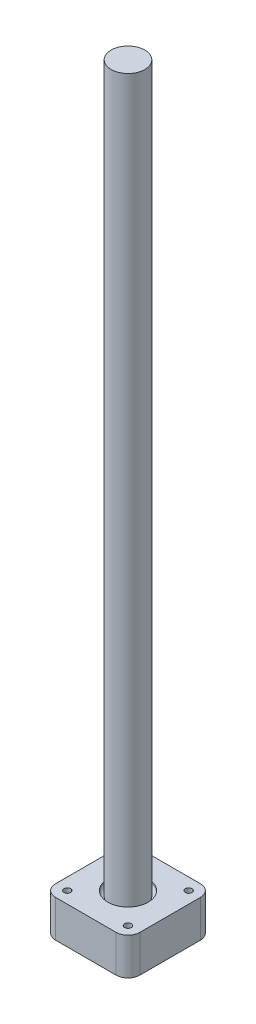
ISO-10303-21;
HEADER;
FILE_DESCRIPTION(('STEP AP214'),'2;1');
FILE_NAME('part.step','',(''),(''),'','','');
FILE_SCHEMA(('AUTOMOTIVE_DESIGN { 1 0 10303 214 1 1 1 1 }'));
ENDSEC;
DATA;
#1=APPLICATION_CONTEXT('core data for automotive mechanical design processes');
#2=APPLICATION_PROTOCOL_DEFINITION('international standard','automotive_design',2000,#1);
#3=PRODUCT_CONTEXT('',#1,'mechanical');
#4=PRODUCT('Part','Part','',(#3));
#5=PRODUCT_RELATED_PRODUCT_CATEGORY('part','',(#4));
#6=PRODUCT_DEFINITION_FORMATION('','',#4);
#7=PRODUCT_DEFINITION_CONTEXT('part definition',#1,'design');
#8=PRODUCT_DEFINITION('design','',#6,#7);
#9=PRODUCT_DEFINITION_SHAPE('','',#8);
#10=(LENGTH_UNIT() NAMED_UNIT(*) SI_UNIT(.MILLI.,.METRE.));
#11=(NAMED_UNIT(*) PLANE_ANGLE_UNIT() SI_UNIT($,.RADIAN.));
#12=(NAMED_UNIT(*) SI_UNIT($,.STERADIAN.) SOLID_ANGLE_UNIT());
#13=UNCERTAINTY_MEASURE_WITH_UNIT(LENGTH_MEASURE(1.E-05),#10,'distance_accuracy_value','');
#14=(GEOMETRIC_REPRESENTATION_CONTEXT(3) GLOBAL_UNCERTAINTY_ASSIGNED_CONTEXT((#13)) GLOBAL_UNIT_ASSIGNED_CONTEXT((#10,
#11,#12)) REPRESENTATION_CONTEXT('',''));
#15=CARTESIAN_POINT('',(0.,0.,0.));
#16=DIRECTION('',(0.,0.,1.));
#17=DIRECTION('',(1.,0.,0.));
#18=AXIS2_PLACEMENT_3D('',#15,#16,#17);
#19=CARTESIAN_POINT('',(50.,22.,0.));
#20=DIRECTION('',(0.,0.,1.));
#21=DIRECTION('',(1.,0.,0.));
#22=AXIS2_PLACEMENT_3D('',#19,#20,#21);
#23=PLANE('',#22);
#24=DIRECTION('',(-1.,0.,0.));
#25=VECTOR('',#24,1.);
#26=CARTESIAN_POINT('',(50.,0.,0.));
#27=LINE('',#26,#25);
#28=CARTESIAN_POINT('',(43.,0.,0.));
#29=VERTEX_POINT('',#28);
#30=CARTESIAN_POINT('',(7.,0.,0.));
#31=VERTEX_POINT('',#30);
#32=EDGE_CURVE('E128',#29,#31,#27,.T.);
#33=ORIENTED_EDGE('',*,*,#32,.T.);
#34=DIRECTION('',(0.,-1.,0.));
#35=VECTOR('',#34,1.);
#36=CARTESIAN_POINT('',(7.,22.,0.));
#37=LINE('',#36,#35);
#38=CARTESIAN_POINT('',(7.,22.,0.));
#39=VERTEX_POINT('',#38);
#40=EDGE_CURVE('E106',#31,#39,#37,.F.);
#41=ORIENTED_EDGE('',*,*,#40,.T.);
#42=DIRECTION('',(-1.,0.,0.));
#43=VECTOR('',#42,1.);
#44=CARTESIAN_POINT('',(50.,22.,0.));
#45=LINE('',#44,#43);
#46=CARTESIAN_POINT('',(43.,22.,0.));
#47=VERTEX_POINT('',#46);
#48=EDGE_CURVE('E138',#47,#39,#45,.T.);
#49=ORIENTED_EDGE('',*,*,#48,.F.);
#50=DIRECTION('',(0.,-1.,0.));
#51=VECTOR('',#50,1.);
#52=CARTESIAN_POINT('',(43.,22.,0.));
#53=LINE('',#52,#51);
#54=EDGE_CURVE('E111',#47,#29,#53,.T.);
#55=ORIENTED_EDGE('',*,*,#54,.T.);
#56=EDGE_LOOP('',(#33,#41,#49,#55));
#57=FACE_BOUND('',#56,.T.);
#58=ADVANCED_FACE('F34',(#57),#23,.F.);
#59=CARTESIAN_POINT('',(0.,22.,0.));
#60=DIRECTION('',(1.,0.,0.));
#61=DIRECTION('',(0.,0.,-1.));
#62=AXIS2_PLACEMENT_3D('',#59,#60,#61);
#63=PLANE('',#62);
#64=DIRECTION('',(0.,0.,1.));
#65=VECTOR('',#64,1.);
#66=CARTESIAN_POINT('',(0.,22.,0.));
#67=LINE('',#66,#65);
#68=CARTESIAN_POINT('',(0.,22.,7.));
#69=VERTEX_POINT('',#68);
#70=CARTESIAN_POINT('',(0.,22.,43.));
#71=VERTEX_POINT('',#70);
#72=EDGE_CURVE('E121',#69,#71,#67,.T.);
#73=ORIENTED_EDGE('',*,*,#72,.F.);
#74=DIRECTION('',(0.,-1.,0.));
#75=VECTOR('',#74,1.);
#76=CARTESIAN_POINT('',(0.,22.,7.));
#77=LINE('',#76,#75);
#78=CARTESIAN_POINT('',(0.,0.,7.));
#79=VERTEX_POINT('',#78);
#80=EDGE_CURVE('E105',#69,#79,#77,.T.);
#81=ORIENTED_EDGE('',*,*,#80,.T.);
#82=DIRECTION('',(0.,0.,1.));
#83=VECTOR('',#82,1.);
#84=CARTESIAN_POINT('',(0.,0.,0.));
#85=LINE('',#84,#83);
#86=CARTESIAN_POINT('',(0.,0.,43.));
#87=VERTEX_POINT('',#86);
#88=EDGE_CURVE('E118',#79,#87,#85,.T.);
#89=ORIENTED_EDGE('',*,*,#88,.T.);
#90=DIRECTION('',(0.,-1.,0.));
#91=VECTOR('',#90,1.);
#92=CARTESIAN_POINT('',(0.,22.,43.));
#93=LINE('',#92,#91);
#94=EDGE_CURVE('E123',#87,#71,#93,.F.);
#95=ORIENTED_EDGE('',*,*,#94,.T.);
#96=EDGE_LOOP('',(#73,#81,#89,#95));
#97=FACE_BOUND('',#96,.T.);
#98=ADVANCED_FACE('F117',(#97),#63,.F.);
#99=CARTESIAN_POINT('',(0.,22.,50.));
#100=DIRECTION('',(0.,0.,-1.));
#101=DIRECTION('',(-1.,0.,0.));
#102=AXIS2_PLACEMENT_3D('',#99,#100,#101);
#103=PLANE('',#102);
#104=DIRECTION('',(1.,0.,0.));
#105=VECTOR('',#104,1.);
#106=CARTESIAN_POINT('',(0.,0.,50.));
#107=LINE('',#106,#105);
#108=CARTESIAN_POINT('',(7.00000000000001,0.,50.));
#109=VERTEX_POINT('',#108);
#110=CARTESIAN_POINT('',(43.,0.,50.));
#111=VERTEX_POINT('',#110);
#112=EDGE_CURVE('E127',#109,#111,#107,.T.);
#113=ORIENTED_EDGE('',*,*,#112,.T.);
#114=DIRECTION('',(0.,-1.,0.));
#115=VECTOR('',#114,1.);
#116=CARTESIAN_POINT('',(43.,22.,50.));
#117=LINE('',#116,#115);
#118=CARTESIAN_POINT('',(43.,22.,50.));
#119=VERTEX_POINT('',#118);
#120=EDGE_CURVE('E162',#111,#119,#117,.F.);
#121=ORIENTED_EDGE('',*,*,#120,.T.);
#122=DIRECTION('',(1.,0.,0.));
#123=VECTOR('',#122,1.);
#124=CARTESIAN_POINT('',(0.,22.,50.));
#125=LINE('',#124,#123);
#126=CARTESIAN_POINT('',(7.00000000000001,22.,50.));
#127=VERTEX_POINT('',#126);
#128=EDGE_CURVE('E216',#127,#119,#125,.T.);
#129=ORIENTED_EDGE('',*,*,#128,.F.);
#130=DIRECTION('',(0.,-1.,0.));
#131=VECTOR('',#130,1.);
#132=CARTESIAN_POINT('',(7.00000000000001,22.,50.));
#133=LINE('',#132,#131);
#134=EDGE_CURVE('E159',#127,#109,#133,.T.);
#135=ORIENTED_EDGE('',*,*,#134,.T.);
#136=EDGE_LOOP('',(#113,#121,#129,#135));
#137=FACE_BOUND('',#136,.T.);
#138=ADVANCED_FACE('F188',(#137),#103,.F.);
#139=CARTESIAN_POINT('',(50.,22.,50.));
#140=DIRECTION('',(-1.,0.,0.));
#141=DIRECTION('',(0.,0.,1.));
#142=AXIS2_PLACEMENT_3D('',#139,#140,#141);
#143=PLANE('',#142);
#144=DIRECTION('',(0.,0.,-1.));
#145=VECTOR('',#144,1.);
#146=CARTESIAN_POINT('',(50.,0.,50.));
#147=LINE('',#146,#145);
#148=CARTESIAN_POINT('',(50.,0.,43.));
#149=VERTEX_POINT('',#148);
#150=CARTESIAN_POINT('',(50.,0.,7.));
#151=VERTEX_POINT('',#150);
#152=EDGE_CURVE('E131',#149,#151,#147,.T.);
#153=ORIENTED_EDGE('',*,*,#152,.T.);
#154=DIRECTION('',(0.,-1.,0.));
#155=VECTOR('',#154,1.);
#156=CARTESIAN_POINT('',(50.,22.,7.));
#157=LINE('',#156,#155);
#158=CARTESIAN_POINT('',(50.,22.,7.));
#159=VERTEX_POINT('',#158);
#160=EDGE_CURVE('E49',#151,#159,#157,.F.);
#161=ORIENTED_EDGE('',*,*,#160,.T.);
#162=DIRECTION('',(0.,0.,-1.));
#163=VECTOR('',#162,1.);
#164=CARTESIAN_POINT('',(50.,22.,50.));
#165=LINE('',#164,#163);
#166=CARTESIAN_POINT('',(50.,22.,43.));
#167=VERTEX_POINT('',#166);
#168=EDGE_CURVE('E139',#167,#159,#165,.T.);
#169=ORIENTED_EDGE('',*,*,#168,.F.);
#170=DIRECTION('',(0.,-1.,0.));
#171=VECTOR('',#170,1.);
#172=CARTESIAN_POINT('',(50.,22.,43.));
#173=LINE('',#172,#171);
#174=EDGE_CURVE('E155',#167,#149,#173,.T.);
#175=ORIENTED_EDGE('',*,*,#174,.T.);
#176=EDGE_LOOP('',(#153,#161,#169,#175));
#177=FACE_BOUND('',#176,.T.);
#178=ADVANCED_FACE('F270',(#177),#143,.F.);
#179=CARTESIAN_POINT('',(0.,22.,0.));
#180=DIRECTION('',(0.,1.,0.));
#181=DIRECTION('',(0.,0.,1.));
#182=AXIS2_PLACEMENT_3D('',#179,#180,#181);
#183=PLANE('',#182);
#184=CARTESIAN_POINT('',(25.,22.,25.));
#185=DIRECTION('',(0.,1.,0.));
#186=DIRECTION('',(0.,0.,1.));
#187=AXIS2_PLACEMENT_3D('',#184,#185,#186);
#188=CIRCLE('',#187,12.);
#189=CARTESIAN_POINT('',(25.,22.,37.));
#190=VERTEX_POINT('',#189);
#191=EDGE_CURVE('E233',#190,#190,#188,.T.);
#192=ORIENTED_EDGE('',*,*,#191,.F.);
#193=EDGE_LOOP('',(#192));
#194=FACE_BOUND('',#193,.T.);
#195=CARTESIAN_POINT('',(43.,22.,7.));
#196=DIRECTION('',(0.,1.,0.));
#197=DIRECTION('',(0.,0.,1.));
#198=AXIS2_PLACEMENT_3D('',#195,#196,#197);
#199=CIRCLE('',#198,2.);
#200=CARTESIAN_POINT('',(43.,22.,9.));
#201=VERTEX_POINT('',#200);
#202=EDGE_CURVE('E229',#201,#201,#199,.T.);
#203=ORIENTED_EDGE('',*,*,#202,.F.);
#204=EDGE_LOOP('',(#203));
#205=FACE_BOUND('',#204,.T.);
#206=CARTESIAN_POINT('',(43.,22.,43.));
#207=DIRECTION('',(0.,1.,0.));
#208=DIRECTION('',(0.,0.,1.));
#209=AXIS2_PLACEMENT_3D('',#206,#207,#208);
#210=CIRCLE('',#209,2.);
#211=CARTESIAN_POINT('',(43.,22.,45.));
#212=VERTEX_POINT('',#211);
#213=EDGE_CURVE('E236',#212,#212,#210,.T.);
#214=ORIENTED_EDGE('',*,*,#213,.F.);
#215=EDGE_LOOP('',(#214));
#216=FACE_BOUND('',#215,.T.);
#217=CARTESIAN_POINT('',(7.00000000000001,22.,43.));
#218=DIRECTION('',(0.,1.,0.));
#219=DIRECTION('',(0.,0.,1.));
#220=AXIS2_PLACEMENT_3D('',#217,#218,#219);
#221=CIRCLE('',#220,2.);
#222=CARTESIAN_POINT('',(7.00000000000001,22.,45.));
#223=VERTEX_POINT('',#222);
#224=EDGE_CURVE('E242',#223,#223,#221,.T.);
#225=ORIENTED_EDGE('',*,*,#224,.F.);
#226=EDGE_LOOP('',(#225));
#227=FACE_BOUND('',#226,.T.);
#228=CARTESIAN_POINT('',(7.,22.,7.));
#229=DIRECTION('',(0.,1.,0.));
#230=DIRECTION('',(0.,0.,1.));
#231=AXIS2_PLACEMENT_3D('',#228,#229,#230);
#232=CIRCLE('',#231,2.);
#233=CARTESIAN_POINT('',(7.,22.,9.));
#234=VERTEX_POINT('',#233);
#235=EDGE_CURVE('E223',#234,#234,#232,.T.);
#236=ORIENTED_EDGE('',*,*,#235,.F.);
#237=EDGE_LOOP('',(#236));
#238=FACE_BOUND('',#237,.T.);
#239=ORIENTED_EDGE('',*,*,#48,.T.);
#240=CARTESIAN_POINT('',(7.,22.,7.));
#241=DIRECTION('',(0.,1.,0.));
#242=DIRECTION('',(0.,0.,1.));
#243=AXIS2_PLACEMENT_3D('',#240,#241,#242);
#244=CIRCLE('',#243,7.);
#245=EDGE_CURVE('E153',#39,#69,#244,.T.);
#246=ORIENTED_EDGE('',*,*,#245,.T.);
#247=ORIENTED_EDGE('',*,*,#72,.T.);
#248=CARTESIAN_POINT('',(7.00000000000001,22.,43.));
#249=DIRECTION('',(0.,1.,0.));
#250=DIRECTION('',(0.,0.,1.));
#251=AXIS2_PLACEMENT_3D('',#248,#249,#250);
#252=CIRCLE('',#251,7.);
#253=EDGE_CURVE('E148',#71,#127,#252,.T.);
#254=ORIENTED_EDGE('',*,*,#253,.T.);
#255=ORIENTED_EDGE('',*,*,#128,.T.);
#256=CARTESIAN_POINT('',(43.,22.,43.));
#257=DIRECTION('',(0.,1.,0.));
#258=DIRECTION('',(0.,0.,1.));
#259=AXIS2_PLACEMENT_3D('',#256,#257,#258);
#260=CIRCLE('',#259,7.);
#261=EDGE_CURVE('E56',#119,#167,#260,.T.);
#262=ORIENTED_EDGE('',*,*,#261,.T.);
#263=ORIENTED_EDGE('',*,*,#168,.T.);
#264=CARTESIAN_POINT('',(43.,22.,7.));
#265=DIRECTION('',(0.,1.,0.));
#266=DIRECTION('',(0.,0.,1.));
#267=AXIS2_PLACEMENT_3D('',#264,#265,#266);
#268=CIRCLE('',#267,7.);
#269=EDGE_CURVE('E151',#159,#47,#268,.T.);
#270=ORIENTED_EDGE('',*,*,#269,.T.);
#271=EDGE_LOOP('',(#239,#246,#247,#254,#255,#262,#263,#270));
#272=FACE_BOUND('',#271,.T.);
#273=ADVANCED_FACE('F215',(#194,#205,#216,#227,#238,#272),#183,.T.);
#274=CARTESIAN_POINT('',(0.,0.,0.));
#275=DIRECTION('',(0.,1.,0.));
#276=DIRECTION('',(0.,0.,1.));
#277=AXIS2_PLACEMENT_3D('',#274,#275,#276);
#278=PLANE('',#277);
#279=CARTESIAN_POINT('',(43.,0.,7.));
#280=DIRECTION('',(0.,1.,0.));
#281=DIRECTION('',(0.,0.,1.));
#282=AXIS2_PLACEMENT_3D('',#279,#280,#281);
#283=CIRCLE('',#282,2.);
#284=CARTESIAN_POINT('',(43.,0.,9.));
#285=VERTEX_POINT('',#284);
#286=EDGE_CURVE('E232',#285,#285,#283,.T.);
#287=ORIENTED_EDGE('',*,*,#286,.T.);
#288=EDGE_LOOP('',(#287));
#289=FACE_BOUND('',#288,.T.);
#290=CARTESIAN_POINT('',(43.,0.,43.));
#291=DIRECTION('',(0.,1.,0.));
#292=DIRECTION('',(0.,0.,1.));
#293=AXIS2_PLACEMENT_3D('',#290,#291,#292);
#294=CIRCLE('',#293,2.);
#295=CARTESIAN_POINT('',(43.,0.,45.));
#296=VERTEX_POINT('',#295);
#297=EDGE_CURVE('E239',#296,#296,#294,.T.);
#298=ORIENTED_EDGE('',*,*,#297,.T.);
#299=EDGE_LOOP('',(#298));
#300=FACE_BOUND('',#299,.T.);
#301=CARTESIAN_POINT('',(7.00000000000001,0.,43.));
#302=DIRECTION('',(0.,1.,0.));
#303=DIRECTION('',(0.,0.,1.));
#304=AXIS2_PLACEMENT_3D('',#301,#302,#303);
#305=CIRCLE('',#304,2.);
#306=CARTESIAN_POINT('',(7.00000000000001,0.,45.));
#307=VERTEX_POINT('',#306);
#308=EDGE_CURVE('E226',#307,#307,#305,.T.);
#309=ORIENTED_EDGE('',*,*,#308,.T.);
#310=EDGE_LOOP('',(#309));
#311=FACE_BOUND('',#310,.T.);
#312=CARTESIAN_POINT('',(7.,0.,7.));
#313=DIRECTION('',(0.,1.,0.));
#314=DIRECTION('',(0.,0.,1.));
#315=AXIS2_PLACEMENT_3D('',#312,#313,#314);
#316=CIRCLE('',#315,2.);
#317=CARTESIAN_POINT('',(7.,0.,9.));
#318=VERTEX_POINT('',#317);
#319=EDGE_CURVE('E133',#318,#318,#316,.T.);
#320=ORIENTED_EDGE('',*,*,#319,.T.);
#321=EDGE_LOOP('',(#320));
#322=FACE_BOUND('',#321,.T.);
#323=ORIENTED_EDGE('',*,*,#88,.F.);
#324=CARTESIAN_POINT('',(7.,0.,7.));
#325=DIRECTION('',(0.,1.,0.));
#326=DIRECTION('',(0.,0.,1.));
#327=AXIS2_PLACEMENT_3D('',#324,#325,#326);
#328=CIRCLE('',#327,7.);
#329=EDGE_CURVE('E101',#79,#31,#328,.F.);
#330=ORIENTED_EDGE('',*,*,#329,.T.);
#331=ORIENTED_EDGE('',*,*,#32,.F.);
#332=CARTESIAN_POINT('',(43.,0.,7.));
#333=DIRECTION('',(0.,1.,0.));
#334=DIRECTION('',(0.,0.,1.));
#335=AXIS2_PLACEMENT_3D('',#332,#333,#334);
#336=CIRCLE('',#335,7.);
#337=EDGE_CURVE('E112',#29,#151,#336,.F.);
#338=ORIENTED_EDGE('',*,*,#337,.T.);
#339=ORIENTED_EDGE('',*,*,#152,.F.);
#340=CARTESIAN_POINT('',(43.,0.,43.));
#341=DIRECTION('',(0.,1.,0.));
#342=DIRECTION('',(0.,0.,1.));
#343=AXIS2_PLACEMENT_3D('',#340,#341,#342);
#344=CIRCLE('',#343,7.);
#345=EDGE_CURVE('E142',#149,#111,#344,.F.);
#346=ORIENTED_EDGE('',*,*,#345,.T.);
#347=ORIENTED_EDGE('',*,*,#112,.F.);
#348=CARTESIAN_POINT('',(7.00000000000001,0.,43.));
#349=DIRECTION('',(0.,1.,0.));
#350=DIRECTION('',(0.,0.,1.));
#351=AXIS2_PLACEMENT_3D('',#348,#349,#350);
#352=CIRCLE('',#351,7.);
#353=EDGE_CURVE('E122',#109,#87,#352,.F.);
#354=ORIENTED_EDGE('',*,*,#353,.T.);
#355=EDGE_LOOP('',(#323,#330,#331,#338,#339,#346,#347,#354));
#356=FACE_BOUND('',#355,.T.);
#357=ADVANCED_FACE('F125',(#289,#300,#311,#322,#356),#278,.F.);
#358=CARTESIAN_POINT('',(7.,22.,7.));
#359=DIRECTION('',(0.,-1.,0.));
#360=DIRECTION('',(0.,0.,-1.));
#361=AXIS2_PLACEMENT_3D('',#358,#359,#360);
#362=CYLINDRICAL_SURFACE('',#361,7.);
#363=ORIENTED_EDGE('',*,*,#245,.F.);
#364=ORIENTED_EDGE('',*,*,#40,.F.);
#365=ORIENTED_EDGE('',*,*,#329,.F.);
#366=ORIENTED_EDGE('',*,*,#80,.F.);
#367=EDGE_LOOP('',(#363,#364,#365,#366));
#368=FACE_BOUND('',#367,.T.);
#369=ADVANCED_FACE('F104',(#368),#362,.T.);
#370=CARTESIAN_POINT('',(43.,22.,7.));
#371=DIRECTION('',(0.,-1.,0.));
#372=DIRECTION('',(0.,0.,-1.));
#373=AXIS2_PLACEMENT_3D('',#370,#371,#372);
#374=CYLINDRICAL_SURFACE('',#373,7.);
#375=ORIENTED_EDGE('',*,*,#269,.F.);
#376=ORIENTED_EDGE('',*,*,#160,.F.);
#377=ORIENTED_EDGE('',*,*,#337,.F.);
#378=ORIENTED_EDGE('',*,*,#54,.F.);
#379=EDGE_LOOP('',(#375,#376,#377,#378));
#380=FACE_BOUND('',#379,.T.);
#381=ADVANCED_FACE('F194',(#380),#374,.T.);
#382=CARTESIAN_POINT('',(43.,22.,43.));
#383=DIRECTION('',(0.,-1.,0.));
#384=DIRECTION('',(0.,0.,-1.));
#385=AXIS2_PLACEMENT_3D('',#382,#383,#384);
#386=CYLINDRICAL_SURFACE('',#385,7.);
#387=ORIENTED_EDGE('',*,*,#261,.F.);
#388=ORIENTED_EDGE('',*,*,#120,.F.);
#389=ORIENTED_EDGE('',*,*,#345,.F.);
#390=ORIENTED_EDGE('',*,*,#174,.F.);
#391=EDGE_LOOP('',(#387,#388,#389,#390));
#392=FACE_BOUND('',#391,.T.);
#393=ADVANCED_FACE('F197',(#392),#386,.T.);
#394=CARTESIAN_POINT('',(7.00000000000001,22.,43.));
#395=DIRECTION('',(0.,-1.,0.));
#396=DIRECTION('',(0.,0.,-1.));
#397=AXIS2_PLACEMENT_3D('',#394,#395,#396);
#398=CYLINDRICAL_SURFACE('',#397,7.);
#399=ORIENTED_EDGE('',*,*,#253,.F.);
#400=ORIENTED_EDGE('',*,*,#94,.F.);
#401=ORIENTED_EDGE('',*,*,#353,.F.);
#402=ORIENTED_EDGE('',*,*,#134,.F.);
#403=EDGE_LOOP('',(#399,#400,#401,#402));
#404=FACE_BOUND('',#403,.T.);
#405=ADVANCED_FACE('F200',(#404),#398,.T.);
#406=CARTESIAN_POINT('',(7.,0.,7.));
#407=DIRECTION('',(0.,1.,0.));
#408=DIRECTION('',(0.,0.,1.));
#409=AXIS2_PLACEMENT_3D('',#406,#407,#408);
#410=CYLINDRICAL_SURFACE('',#409,2.);
#411=ORIENTED_EDGE('',*,*,#319,.F.);
#412=EDGE_LOOP('',(#411));
#413=FACE_BOUND('',#412,.T.);
#414=ORIENTED_EDGE('',*,*,#235,.T.);
#415=EDGE_LOOP('',(#414));
#416=FACE_BOUND('',#415,.T.);
#417=ADVANCED_FACE('F203',(#413,#416),#410,.F.);
#418=CARTESIAN_POINT('',(7.00000000000001,0.,43.));
#419=DIRECTION('',(0.,1.,0.));
#420=DIRECTION('',(0.,0.,1.));
#421=AXIS2_PLACEMENT_3D('',#418,#419,#420);
#422=CYLINDRICAL_SURFACE('',#421,2.);
#423=ORIENTED_EDGE('',*,*,#308,.F.);
#424=EDGE_LOOP('',(#423));
#425=FACE_BOUND('',#424,.T.);
#426=ORIENTED_EDGE('',*,*,#224,.T.);
#427=EDGE_LOOP('',(#426));
#428=FACE_BOUND('',#427,.T.);
#429=ADVANCED_FACE('F208',(#425,#428),#422,.F.);
#430=CARTESIAN_POINT('',(43.,0.,43.));
#431=DIRECTION('',(0.,1.,0.));
#432=DIRECTION('',(0.,0.,1.));
#433=AXIS2_PLACEMENT_3D('',#430,#431,#432);
#434=CYLINDRICAL_SURFACE('',#433,2.);
#435=ORIENTED_EDGE('',*,*,#297,.F.);
#436=EDGE_LOOP('',(#435));
#437=FACE_BOUND('',#436,.T.);
#438=ORIENTED_EDGE('',*,*,#213,.T.);
#439=EDGE_LOOP('',(#438));
#440=FACE_BOUND('',#439,.T.);
#441=ADVANCED_FACE('F260',(#437,#440),#434,.F.);
#442=CARTESIAN_POINT('',(43.,0.,7.));
#443=DIRECTION('',(0.,1.,0.));
#444=DIRECTION('',(0.,0.,1.));
#445=AXIS2_PLACEMENT_3D('',#442,#443,#444);
#446=CYLINDRICAL_SURFACE('',#445,2.);
#447=ORIENTED_EDGE('',*,*,#286,.F.);
#448=EDGE_LOOP('',(#447));
#449=FACE_BOUND('',#448,.T.);
#450=ORIENTED_EDGE('',*,*,#202,.T.);
#451=EDGE_LOOP('',(#450));
#452=FACE_BOUND('',#451,.T.);
#453=ADVANCED_FACE('F178',(#449,#452),#446,.F.);
#454=CARTESIAN_POINT('',(25.,19.,25.));
#455=DIRECTION('',(0.,1.,0.));
#456=DIRECTION('',(0.,0.,1.));
#457=AXIS2_PLACEMENT_3D('',#454,#455,#456);
#458=CYLINDRICAL_SURFACE('',#457,12.);
#459=CARTESIAN_POINT('',(25.,21.,25.));
#460=DIRECTION('',(0.,1.,0.));
#461=DIRECTION('',(0.,0.,1.));
#462=AXIS2_PLACEMENT_3D('',#459,#460,#461);
#463=CIRCLE('',#462,12.);
#464=CARTESIAN_POINT('',(25.,21.,37.));
#465=VERTEX_POINT('',#464);
#466=EDGE_CURVE('E11',#465,#465,#463,.F.);
#467=ORIENTED_EDGE('',*,*,#466,.T.);
#468=EDGE_LOOP('',(#467));
#469=FACE_BOUND('',#468,.T.);
#470=ORIENTED_EDGE('',*,*,#191,.T.);
#471=EDGE_LOOP('',(#470));
#472=FACE_BOUND('',#471,.T.);
#473=ADVANCED_FACE('F169',(#469,#472),#458,.F.);
#474=CARTESIAN_POINT('',(25.,21.,25.));
#475=DIRECTION('',(0.,1.,0.));
#476=DIRECTION('',(0.,0.,1.));
#477=AXIS2_PLACEMENT_3D('',#474,#475,#476);
#478=TOROIDAL_SURFACE('',#477,10.,2.);
#479=ORIENTED_EDGE('',*,*,#466,.F.);
#480=EDGE_LOOP('',(#479));
#481=FACE_BOUND('',#480,.T.);
#482=CARTESIAN_POINT('',(25.,19.,25.));
#483=DIRECTION('',(0.,1.,0.));
#484=DIRECTION('',(0.,0.,1.));
#485=AXIS2_PLACEMENT_3D('',#482,#483,#484);
#486=CIRCLE('',#485,10.);
#487=CARTESIAN_POINT('',(25.,19.,35.));
#488=VERTEX_POINT('',#487);
#489=EDGE_CURVE('E42',#488,#488,#486,.T.);
#490=ORIENTED_EDGE('',*,*,#489,.F.);
#491=EDGE_LOOP('',(#490));
#492=FACE_BOUND('',#491,.T.);
#493=ADVANCED_FACE('F36',(#481,#492),#478,.F.);
#494=CARTESIAN_POINT('',(25.,449.,25.));
#495=DIRECTION('',(0.,-1.,0.));
#496=DIRECTION('',(0.,0.,-1.));
#497=AXIS2_PLACEMENT_3D('',#494,#495,#496);
#498=CYLINDRICAL_SURFACE('',#497,10.);
#499=CARTESIAN_POINT('',(25.,449.,25.));
#500=DIRECTION('',(0.,1.,0.));
#501=DIRECTION('',(0.,0.,1.));
#502=AXIS2_PLACEMENT_3D('',#499,#500,#501);
#503=CIRCLE('',#502,10.);
#504=CARTESIAN_POINT('',(25.,449.,35.));
#505=VERTEX_POINT('',#504);
#506=EDGE_CURVE('E249',#505,#505,#503,.T.);
#507=ORIENTED_EDGE('',*,*,#506,.F.);
#508=EDGE_LOOP('',(#507));
#509=FACE_BOUND('',#508,.T.);
#510=ORIENTED_EDGE('',*,*,#489,.T.);
#511=EDGE_LOOP('',(#510));
#512=FACE_BOUND('',#511,.T.);
#513=ADVANCED_FACE('F166',(#509,#512),#498,.T.);
#514=CARTESIAN_POINT('',(25.,449.,25.));
#515=DIRECTION('',(0.,1.,0.));
#516=DIRECTION('',(0.,0.,1.));
#517=AXIS2_PLACEMENT_3D('',#514,#515,#516);
#518=PLANE('',#517);
#519=ORIENTED_EDGE('',*,*,#506,.T.);
#520=EDGE_LOOP('',(#519));
#521=FACE_BOUND('',#520,.T.);
#522=ADVANCED_FACE('F175',(#521),#518,.T.);
#523=CLOSED_SHELL('',(#58,#98,#138,#178,#273,#357,#369,#381,#393,#405,#417,#429,#441,#453,#473,
#493,#513,#522));
#524=MANIFOLD_SOLID_BREP('B2',#523);
#525=ADVANCED_BREP_SHAPE_REPRESENTATION('',(#18,#524),#14);
#526=SHAPE_DEFINITION_REPRESENTATION(#9,#525);
ENDSEC;
END-ISO-10303-21;
